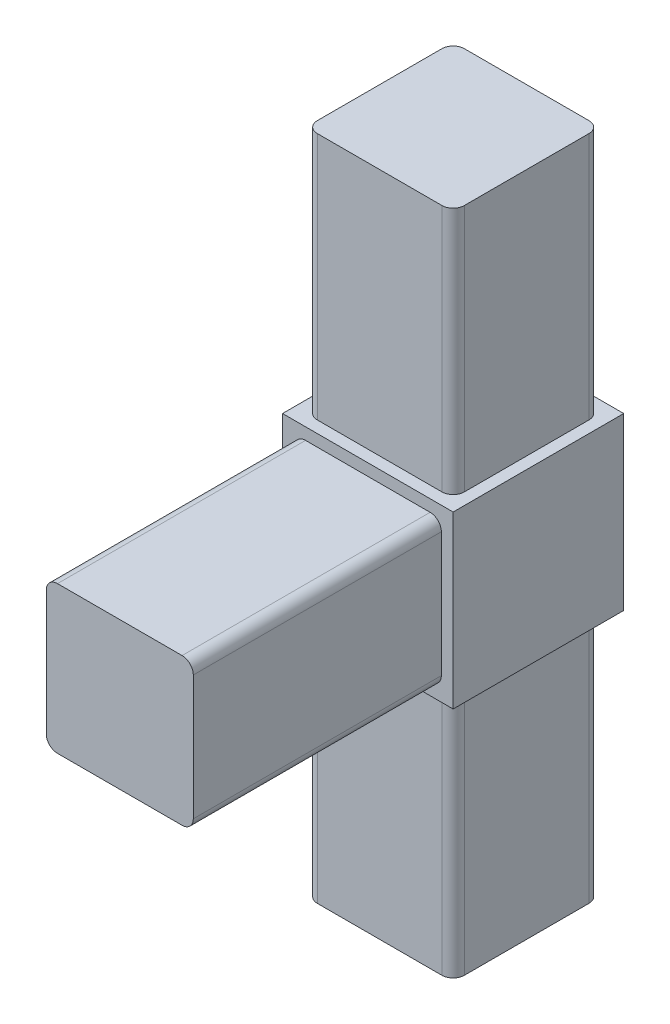
ISO-10303-21;
HEADER;
FILE_DESCRIPTION(('STEP AP214'),'2;1');
FILE_NAME('part.step','',(''),(''),'','','');
FILE_SCHEMA(('AUTOMOTIVE_DESIGN { 1 0 10303 214 1 1 1 1 }'));
ENDSEC;
DATA;
#1=APPLICATION_CONTEXT('core data for automotive mechanical design processes');
#2=APPLICATION_PROTOCOL_DEFINITION('international standard','automotive_design',2000,#1);
#3=PRODUCT_CONTEXT('',#1,'mechanical');
#4=PRODUCT('Part','Part','',(#3));
#5=PRODUCT_RELATED_PRODUCT_CATEGORY('part','',(#4));
#6=PRODUCT_DEFINITION_FORMATION('','',#4);
#7=PRODUCT_DEFINITION_CONTEXT('part definition',#1,'design');
#8=PRODUCT_DEFINITION('design','',#6,#7);
#9=PRODUCT_DEFINITION_SHAPE('','',#8);
#10=(LENGTH_UNIT() NAMED_UNIT(*) SI_UNIT(.MILLI.,.METRE.));
#11=(NAMED_UNIT(*) PLANE_ANGLE_UNIT() SI_UNIT($,.RADIAN.));
#12=(NAMED_UNIT(*) SI_UNIT($,.STERADIAN.) SOLID_ANGLE_UNIT());
#13=UNCERTAINTY_MEASURE_WITH_UNIT(LENGTH_MEASURE(1.E-05),#10,'distance_accuracy_value','');
#14=(GEOMETRIC_REPRESENTATION_CONTEXT(3) GLOBAL_UNCERTAINTY_ASSIGNED_CONTEXT((#13)) GLOBAL_UNIT_ASSIGNED_CONTEXT((#10,
#11,#12)) REPRESENTATION_CONTEXT('',''));
#15=CARTESIAN_POINT('',(0.,0.,0.));
#16=DIRECTION('',(0.,0.,1.));
#17=DIRECTION('',(1.,0.,0.));
#18=AXIS2_PLACEMENT_3D('',#15,#16,#17);
#19=CARTESIAN_POINT('',(0.,47.371,0.));
#20=DIRECTION('',(0.,-1.,0.));
#21=DIRECTION('',(0.,0.,-1.));
#22=AXIS2_PLACEMENT_3D('',#19,#20,#21);
#23=PLANE('',#22);
#24=DIRECTION('',(0.,0.,-1.));
#25=VECTOR('',#24,1.);
#26=CARTESIAN_POINT('',(9.652,47.371,9.652));
#27=LINE('',#26,#25);
#28=CARTESIAN_POINT('',(9.652,47.371,9.652));
#29=VERTEX_POINT('',#28);
#30=CARTESIAN_POINT('',(9.652,47.371,-9.652));
#31=VERTEX_POINT('',#30);
#32=EDGE_CURVE('E229',#29,#31,#27,.T.);
#33=ORIENTED_EDGE('',*,*,#32,.T.);
#34=DIRECTION('',(-1.,0.,0.));
#35=VECTOR('',#34,1.);
#36=CARTESIAN_POINT('',(-9.652,47.371,-9.652));
#37=LINE('',#36,#35);
#38=CARTESIAN_POINT('',(-9.652,47.371,-9.652));
#39=VERTEX_POINT('',#38);
#40=EDGE_CURVE('E218',#31,#39,#37,.T.);
#41=ORIENTED_EDGE('',*,*,#40,.T.);
#42=DIRECTION('',(0.,0.,1.));
#43=VECTOR('',#42,1.);
#44=CARTESIAN_POINT('',(-9.652,47.371,9.652));
#45=LINE('',#44,#43);
#46=CARTESIAN_POINT('',(-9.652,47.371,9.652));
#47=VERTEX_POINT('',#46);
#48=EDGE_CURVE('E228',#39,#47,#45,.T.);
#49=ORIENTED_EDGE('',*,*,#48,.T.);
#50=DIRECTION('',(1.,0.,0.));
#51=VECTOR('',#50,1.);
#52=CARTESIAN_POINT('',(-9.652,47.371,9.652));
#53=LINE('',#52,#51);
#54=EDGE_CURVE('E234',#47,#29,#53,.T.);
#55=ORIENTED_EDGE('',*,*,#54,.T.);
#56=EDGE_LOOP('',(#33,#41,#49,#55));
#57=FACE_BOUND('',#56,.T.);
#58=DIRECTION('',(0.,0.,-1.));
#59=VECTOR('',#58,1.);
#60=CARTESIAN_POINT('',(8.3185,47.371,8.3185));
#61=LINE('',#60,#59);
#62=CARTESIAN_POINT('',(8.3185,47.371,7.0485));
#63=VERTEX_POINT('',#62);
#64=CARTESIAN_POINT('',(8.3185,47.371,-7.0485));
#65=VERTEX_POINT('',#64);
#66=EDGE_CURVE('E596',#63,#65,#61,.T.);
#67=ORIENTED_EDGE('',*,*,#66,.F.);
#68=CARTESIAN_POINT('',(7.0485,47.371,7.0485));
#69=DIRECTION('',(0.,-1.,0.));
#70=DIRECTION('',(0.,0.,-1.));
#71=AXIS2_PLACEMENT_3D('',#68,#69,#70);
#72=CIRCLE('',#71,1.27);
#73=CARTESIAN_POINT('',(7.0485,47.371,8.3185));
#74=VERTEX_POINT('',#73);
#75=EDGE_CURVE('E357',#63,#74,#72,.T.);
#76=ORIENTED_EDGE('',*,*,#75,.T.);
#77=DIRECTION('',(1.,0.,0.));
#78=VECTOR('',#77,1.);
#79=CARTESIAN_POINT('',(-8.3185,47.371,8.3185));
#80=LINE('',#79,#78);
#81=CARTESIAN_POINT('',(-7.0485,47.371,8.3185));
#82=VERTEX_POINT('',#81);
#83=EDGE_CURVE('E405',#82,#74,#80,.T.);
#84=ORIENTED_EDGE('',*,*,#83,.F.);
#85=CARTESIAN_POINT('',(-7.0485,47.371,7.0485));
#86=DIRECTION('',(0.,-1.,0.));
#87=DIRECTION('',(0.,0.,-1.));
#88=AXIS2_PLACEMENT_3D('',#85,#86,#87);
#89=CIRCLE('',#88,1.27);
#90=CARTESIAN_POINT('',(-8.3185,47.371,7.0485));
#91=VERTEX_POINT('',#90);
#92=EDGE_CURVE('E355',#82,#91,#89,.T.);
#93=ORIENTED_EDGE('',*,*,#92,.T.);
#94=DIRECTION('',(0.,0.,1.));
#95=VECTOR('',#94,1.);
#96=CARTESIAN_POINT('',(-8.3185,47.371,8.3185));
#97=LINE('',#96,#95);
#98=CARTESIAN_POINT('',(-8.3185,47.371,-7.0485));
#99=VERTEX_POINT('',#98);
#100=EDGE_CURVE('E591',#99,#91,#97,.T.);
#101=ORIENTED_EDGE('',*,*,#100,.F.);
#102=CARTESIAN_POINT('',(-7.0485,47.371,-7.0485));
#103=DIRECTION('',(0.,-1.,0.));
#104=DIRECTION('',(0.,0.,-1.));
#105=AXIS2_PLACEMENT_3D('',#102,#103,#104);
#106=CIRCLE('',#105,1.27);
#107=CARTESIAN_POINT('',(-7.0485,47.371,-8.3185));
#108=VERTEX_POINT('',#107);
#109=EDGE_CURVE('E359',#99,#108,#106,.T.);
#110=ORIENTED_EDGE('',*,*,#109,.T.);
#111=DIRECTION('',(-1.,0.,0.));
#112=VECTOR('',#111,1.);
#113=CARTESIAN_POINT('',(-8.3185,47.371,-8.3185));
#114=LINE('',#113,#112);
#115=CARTESIAN_POINT('',(7.0485,47.371,-8.3185));
#116=VERTEX_POINT('',#115);
#117=EDGE_CURVE('E594',#116,#108,#114,.T.);
#118=ORIENTED_EDGE('',*,*,#117,.F.);
#119=CARTESIAN_POINT('',(7.0485,47.371,-7.0485));
#120=DIRECTION('',(0.,-1.,0.));
#121=DIRECTION('',(0.,0.,-1.));
#122=AXIS2_PLACEMENT_3D('',#119,#120,#121);
#123=CIRCLE('',#122,1.27);
#124=EDGE_CURVE('E361',#116,#65,#123,.T.);
#125=ORIENTED_EDGE('',*,*,#124,.T.);
#126=EDGE_LOOP('',(#67,#76,#84,#93,#101,#110,#118,#125));
#127=FACE_BOUND('',#126,.T.);
#128=ADVANCED_FACE('F34',(#57,#127),#23,.F.);
#129=CARTESIAN_POINT('',(-9.652,47.371,9.652));
#130=DIRECTION('',(0.,0.,-1.));
#131=DIRECTION('',(-1.,0.,0.));
#132=AXIS2_PLACEMENT_3D('',#129,#130,#131);
#133=PLANE('',#132);
#134=DIRECTION('',(1.,0.,0.));
#135=VECTOR('',#134,1.);
#136=CARTESIAN_POINT('',(-9.652,28.067,9.652));
#137=LINE('',#136,#135);
#138=CARTESIAN_POINT('',(-9.652,28.067,9.652));
#139=VERTEX_POINT('',#138);
#140=CARTESIAN_POINT('',(9.652,28.067,9.652));
#141=VERTEX_POINT('',#140);
#142=EDGE_CURVE('E238',#139,#141,#137,.T.);
#143=ORIENTED_EDGE('',*,*,#142,.T.);
#144=DIRECTION('',(0.,-1.,0.));
#145=VECTOR('',#144,1.);
#146=CARTESIAN_POINT('',(9.652,47.371,9.652));
#147=LINE('',#146,#145);
#148=EDGE_CURVE('E419',#29,#141,#147,.T.);
#149=ORIENTED_EDGE('',*,*,#148,.F.);
#150=ORIENTED_EDGE('',*,*,#54,.F.);
#151=DIRECTION('',(0.,-1.,0.));
#152=VECTOR('',#151,1.);
#153=CARTESIAN_POINT('',(-9.652,47.371,9.652));
#154=LINE('',#153,#152);
#155=EDGE_CURVE('E248',#47,#139,#154,.T.);
#156=ORIENTED_EDGE('',*,*,#155,.T.);
#157=EDGE_LOOP('',(#143,#149,#150,#156));
#158=FACE_BOUND('',#157,.T.);
#159=DIRECTION('',(0.,1.,0.));
#160=VECTOR('',#159,1.);
#161=CARTESIAN_POINT('',(8.3185,29.4005,9.652));
#162=LINE('',#161,#160);
#163=CARTESIAN_POINT('',(8.3185,30.6705,9.652));
#164=VERTEX_POINT('',#163);
#165=CARTESIAN_POINT('',(8.3185,44.7675,9.652));
#166=VERTEX_POINT('',#165);
#167=EDGE_CURVE('E378',#164,#166,#162,.T.);
#168=ORIENTED_EDGE('',*,*,#167,.F.);
#169=CARTESIAN_POINT('',(7.0485,30.6705,9.652));
#170=DIRECTION('',(0.,0.,-1.));
#171=DIRECTION('',(-1.,0.,0.));
#172=AXIS2_PLACEMENT_3D('',#169,#170,#171);
#173=CIRCLE('',#172,1.27);
#174=CARTESIAN_POINT('',(7.0485,29.4005,9.652));
#175=VERTEX_POINT('',#174);
#176=EDGE_CURVE('E42',#164,#175,#173,.T.);
#177=ORIENTED_EDGE('',*,*,#176,.T.);
#178=DIRECTION('',(1.,0.,0.));
#179=VECTOR('',#178,1.);
#180=CARTESIAN_POINT('',(-8.3185,29.4005,9.652));
#181=LINE('',#180,#179);
#182=CARTESIAN_POINT('',(-7.0485,29.4005,9.652));
#183=VERTEX_POINT('',#182);
#184=EDGE_CURVE('E377',#183,#175,#181,.T.);
#185=ORIENTED_EDGE('',*,*,#184,.F.);
#186=CARTESIAN_POINT('',(-7.0485,30.6705,9.652));
#187=DIRECTION('',(0.,0.,-1.));
#188=DIRECTION('',(-1.,0.,0.));
#189=AXIS2_PLACEMENT_3D('',#186,#187,#188);
#190=CIRCLE('',#189,1.27);
#191=CARTESIAN_POINT('',(-8.3185,30.6705,9.652));
#192=VERTEX_POINT('',#191);
#193=EDGE_CURVE('E371',#183,#192,#190,.T.);
#194=ORIENTED_EDGE('',*,*,#193,.T.);
#195=DIRECTION('',(0.,-1.,0.));
#196=VECTOR('',#195,1.);
#197=CARTESIAN_POINT('',(-8.3185,29.4005,9.652));
#198=LINE('',#197,#196);
#199=CARTESIAN_POINT('',(-8.3185,44.7675,9.652));
#200=VERTEX_POINT('',#199);
#201=EDGE_CURVE('E385',#200,#192,#198,.T.);
#202=ORIENTED_EDGE('',*,*,#201,.F.);
#203=CARTESIAN_POINT('',(-7.0485,44.7675,9.652));
#204=DIRECTION('',(0.,0.,-1.));
#205=DIRECTION('',(-1.,0.,0.));
#206=AXIS2_PLACEMENT_3D('',#203,#204,#205);
#207=CIRCLE('',#206,1.27);
#208=CARTESIAN_POINT('',(-7.0485,46.0375,9.652));
#209=VERTEX_POINT('',#208);
#210=EDGE_CURVE('E373',#200,#209,#207,.T.);
#211=ORIENTED_EDGE('',*,*,#210,.T.);
#212=DIRECTION('',(-1.,0.,0.));
#213=VECTOR('',#212,1.);
#214=CARTESIAN_POINT('',(-8.3185,46.0375,9.652));
#215=LINE('',#214,#213);
#216=CARTESIAN_POINT('',(7.0485,46.0375,9.652));
#217=VERTEX_POINT('',#216);
#218=EDGE_CURVE('E411',#217,#209,#215,.T.);
#219=ORIENTED_EDGE('',*,*,#218,.F.);
#220=CARTESIAN_POINT('',(7.0485,44.7675,9.652));
#221=DIRECTION('',(0.,0.,-1.));
#222=DIRECTION('',(-1.,0.,0.));
#223=AXIS2_PLACEMENT_3D('',#220,#221,#222);
#224=CIRCLE('',#223,1.27);
#225=EDGE_CURVE('E11',#217,#166,#224,.T.);
#226=ORIENTED_EDGE('',*,*,#225,.T.);
#227=EDGE_LOOP('',(#168,#177,#185,#194,#202,#211,#219,#226));
#228=FACE_BOUND('',#227,.T.);
#229=ADVANCED_FACE('F376',(#158,#228),#133,.F.);
#230=CARTESIAN_POINT('',(8.3185,28.067,-8.3185));
#231=DIRECTION('',(-1.,0.,0.));
#232=DIRECTION('',(0.,0.,1.));
#233=AXIS2_PLACEMENT_3D('',#230,#231,#232);
#234=PLANE('',#233);
#235=DIRECTION('',(0.,0.,-1.));
#236=VECTOR('',#235,1.);
#237=CARTESIAN_POINT('',(8.3185,28.067,-8.3185));
#238=LINE('',#237,#236);
#239=CARTESIAN_POINT('',(8.3185,28.067,7.0485));
#240=VERTEX_POINT('',#239);
#241=CARTESIAN_POINT('',(8.3185,28.067,-7.0485));
#242=VERTEX_POINT('',#241);
#243=EDGE_CURVE('E252',#240,#242,#238,.T.);
#244=ORIENTED_EDGE('',*,*,#243,.F.);
#245=DIRECTION('',(0.,-1.,0.));
#246=VECTOR('',#245,1.);
#247=CARTESIAN_POINT('',(8.3185,28.067,7.0485));
#248=LINE('',#247,#246);
#249=CARTESIAN_POINT('',(8.3185,0.,7.0485));
#250=VERTEX_POINT('',#249);
#251=EDGE_CURVE('E320',#240,#250,#248,.T.);
#252=ORIENTED_EDGE('',*,*,#251,.T.);
#253=DIRECTION('',(0.,0.,-1.));
#254=VECTOR('',#253,1.);
#255=CARTESIAN_POINT('',(8.3185,0.,-8.3185));
#256=LINE('',#255,#254);
#257=CARTESIAN_POINT('',(8.3185,0.,-7.0485));
#258=VERTEX_POINT('',#257);
#259=EDGE_CURVE('E243',#250,#258,#256,.T.);
#260=ORIENTED_EDGE('',*,*,#259,.T.);
#261=DIRECTION('',(0.,-1.,0.));
#262=VECTOR('',#261,1.);
#263=CARTESIAN_POINT('',(8.3185,28.067,-7.0485));
#264=LINE('',#263,#262);
#265=EDGE_CURVE('E318',#258,#242,#264,.F.);
#266=ORIENTED_EDGE('',*,*,#265,.T.);
#267=EDGE_LOOP('',(#244,#252,#260,#266));
#268=FACE_BOUND('',#267,.T.);
#269=ADVANCED_FACE('F451',(#268),#234,.F.);
#270=CARTESIAN_POINT('',(-8.3185,28.067,-8.3185));
#271=DIRECTION('',(0.,0.,1.));
#272=DIRECTION('',(1.,0.,0.));
#273=AXIS2_PLACEMENT_3D('',#270,#271,#272);
#274=PLANE('',#273);
#275=DIRECTION('',(-1.,0.,0.));
#276=VECTOR('',#275,1.);
#277=CARTESIAN_POINT('',(-8.3185,0.,-8.3185));
#278=LINE('',#277,#276);
#279=CARTESIAN_POINT('',(7.0485,0.,-8.3185));
#280=VERTEX_POINT('',#279);
#281=CARTESIAN_POINT('',(-7.0485,0.,-8.3185));
#282=VERTEX_POINT('',#281);
#283=EDGE_CURVE('E246',#280,#282,#278,.T.);
#284=ORIENTED_EDGE('',*,*,#283,.T.);
#285=DIRECTION('',(0.,-1.,0.));
#286=VECTOR('',#285,1.);
#287=CARTESIAN_POINT('',(-7.0485,28.067,-8.3185));
#288=LINE('',#287,#286);
#289=CARTESIAN_POINT('',(-7.0485,28.067,-8.3185));
#290=VERTEX_POINT('',#289);
#291=EDGE_CURVE('E326',#282,#290,#288,.F.);
#292=ORIENTED_EDGE('',*,*,#291,.T.);
#293=DIRECTION('',(-1.,0.,0.));
#294=VECTOR('',#293,1.);
#295=CARTESIAN_POINT('',(-8.3185,28.067,-8.3185));
#296=LINE('',#295,#294);
#297=CARTESIAN_POINT('',(7.0485,28.067,-8.3185));
#298=VERTEX_POINT('',#297);
#299=EDGE_CURVE('E255',#298,#290,#296,.T.);
#300=ORIENTED_EDGE('',*,*,#299,.F.);
#301=DIRECTION('',(0.,-1.,0.));
#302=VECTOR('',#301,1.);
#303=CARTESIAN_POINT('',(7.0485,28.067,-8.3185));
#304=LINE('',#303,#302);
#305=EDGE_CURVE('E323',#298,#280,#304,.T.);
#306=ORIENTED_EDGE('',*,*,#305,.T.);
#307=EDGE_LOOP('',(#284,#292,#300,#306));
#308=FACE_BOUND('',#307,.T.);
#309=ADVANCED_FACE('F474',(#308),#274,.F.);
#310=CARTESIAN_POINT('',(-8.3185,28.067,-8.3185));
#311=DIRECTION('',(1.,0.,0.));
#312=DIRECTION('',(0.,0.,-1.));
#313=AXIS2_PLACEMENT_3D('',#310,#311,#312);
#314=PLANE('',#313);
#315=DIRECTION('',(0.,0.,1.));
#316=VECTOR('',#315,1.);
#317=CARTESIAN_POINT('',(-8.3185,0.,-8.3185));
#318=LINE('',#317,#316);
#319=CARTESIAN_POINT('',(-8.3185,0.,-7.0485));
#320=VERTEX_POINT('',#319);
#321=CARTESIAN_POINT('',(-8.3185,0.,7.0485));
#322=VERTEX_POINT('',#321);
#323=EDGE_CURVE('E268',#320,#322,#318,.T.);
#324=ORIENTED_EDGE('',*,*,#323,.T.);
#325=DIRECTION('',(0.,-1.,0.));
#326=VECTOR('',#325,1.);
#327=CARTESIAN_POINT('',(-8.3185,28.067,7.0485));
#328=LINE('',#327,#326);
#329=CARTESIAN_POINT('',(-8.3185,28.067,7.0485));
#330=VERTEX_POINT('',#329);
#331=EDGE_CURVE('E316',#322,#330,#328,.F.);
#332=ORIENTED_EDGE('',*,*,#331,.T.);
#333=DIRECTION('',(0.,0.,1.));
#334=VECTOR('',#333,1.);
#335=CARTESIAN_POINT('',(-8.3185,28.067,-8.3185));
#336=LINE('',#335,#334);
#337=CARTESIAN_POINT('',(-8.3185,28.067,-7.0485));
#338=VERTEX_POINT('',#337);
#339=EDGE_CURVE('E259',#338,#330,#336,.T.);
#340=ORIENTED_EDGE('',*,*,#339,.F.);
#341=DIRECTION('',(0.,-1.,0.));
#342=VECTOR('',#341,1.);
#343=CARTESIAN_POINT('',(-8.3185,28.067,-7.0485));
#344=LINE('',#343,#342);
#345=EDGE_CURVE('E313',#338,#320,#344,.T.);
#346=ORIENTED_EDGE('',*,*,#345,.T.);
#347=EDGE_LOOP('',(#324,#332,#340,#346));
#348=FACE_BOUND('',#347,.T.);
#349=ADVANCED_FACE('F467',(#348),#314,.F.);
#350=CARTESIAN_POINT('',(-8.3185,28.067,8.3185));
#351=DIRECTION('',(0.,0.,-1.));
#352=DIRECTION('',(-1.,0.,0.));
#353=AXIS2_PLACEMENT_3D('',#350,#351,#352);
#354=PLANE('',#353);
#355=DIRECTION('',(1.,0.,0.));
#356=VECTOR('',#355,1.);
#357=CARTESIAN_POINT('',(-8.3185,28.067,8.3185));
#358=LINE('',#357,#356);
#359=CARTESIAN_POINT('',(-7.0485,28.067,8.3185));
#360=VERTEX_POINT('',#359);
#361=CARTESIAN_POINT('',(7.0485,28.067,8.3185));
#362=VERTEX_POINT('',#361);
#363=EDGE_CURVE('E262',#360,#362,#358,.T.);
#364=ORIENTED_EDGE('',*,*,#363,.F.);
#365=DIRECTION('',(0.,-1.,0.));
#366=VECTOR('',#365,1.);
#367=CARTESIAN_POINT('',(-7.0485,28.067,8.3185));
#368=LINE('',#367,#366);
#369=CARTESIAN_POINT('',(-7.0485,0.,8.3185));
#370=VERTEX_POINT('',#369);
#371=EDGE_CURVE('E302',#360,#370,#368,.T.);
#372=ORIENTED_EDGE('',*,*,#371,.T.);
#373=DIRECTION('',(1.,0.,0.));
#374=VECTOR('',#373,1.);
#375=CARTESIAN_POINT('',(-8.3185,0.,8.3185));
#376=LINE('',#375,#374);
#377=CARTESIAN_POINT('',(7.0485,0.,8.3185));
#378=VERTEX_POINT('',#377);
#379=EDGE_CURVE('E256',#370,#378,#376,.T.);
#380=ORIENTED_EDGE('',*,*,#379,.T.);
#381=DIRECTION('',(0.,-1.,0.));
#382=VECTOR('',#381,1.);
#383=CARTESIAN_POINT('',(7.0485,28.067,8.3185));
#384=LINE('',#383,#382);
#385=EDGE_CURVE('E300',#378,#362,#384,.F.);
#386=ORIENTED_EDGE('',*,*,#385,.T.);
#387=EDGE_LOOP('',(#364,#372,#380,#386));
#388=FACE_BOUND('',#387,.T.);
#389=ADVANCED_FACE('F461',(#388),#354,.F.);
#390=CARTESIAN_POINT('',(0.,0.,0.));
#391=DIRECTION('',(0.,1.,0.));
#392=DIRECTION('',(0.,0.,1.));
#393=AXIS2_PLACEMENT_3D('',#390,#391,#392);
#394=PLANE('',#393);
#395=ORIENTED_EDGE('',*,*,#379,.F.);
#396=CARTESIAN_POINT('',(-7.0485,0.,7.0485));
#397=DIRECTION('',(0.,1.,0.));
#398=DIRECTION('',(0.,0.,1.));
#399=AXIS2_PLACEMENT_3D('',#396,#397,#398);
#400=CIRCLE('',#399,1.27);
#401=EDGE_CURVE('E311',#370,#322,#400,.F.);
#402=ORIENTED_EDGE('',*,*,#401,.T.);
#403=ORIENTED_EDGE('',*,*,#323,.F.);
#404=CARTESIAN_POINT('',(-7.0485,0.,-7.0485));
#405=DIRECTION('',(0.,1.,0.));
#406=DIRECTION('',(0.,0.,1.));
#407=AXIS2_PLACEMENT_3D('',#404,#405,#406);
#408=CIRCLE('',#407,1.27);
#409=EDGE_CURVE('E307',#320,#282,#408,.F.);
#410=ORIENTED_EDGE('',*,*,#409,.T.);
#411=ORIENTED_EDGE('',*,*,#283,.F.);
#412=CARTESIAN_POINT('',(7.0485,0.,-7.0485));
#413=DIRECTION('',(0.,1.,0.));
#414=DIRECTION('',(0.,0.,1.));
#415=AXIS2_PLACEMENT_3D('',#412,#413,#414);
#416=CIRCLE('',#415,1.27);
#417=EDGE_CURVE('E305',#280,#258,#416,.F.);
#418=ORIENTED_EDGE('',*,*,#417,.T.);
#419=ORIENTED_EDGE('',*,*,#259,.F.);
#420=CARTESIAN_POINT('',(7.0485,0.,7.0485));
#421=DIRECTION('',(0.,1.,0.));
#422=DIRECTION('',(0.,0.,1.));
#423=AXIS2_PLACEMENT_3D('',#420,#421,#422);
#424=CIRCLE('',#423,1.27);
#425=EDGE_CURVE('E309',#250,#378,#424,.F.);
#426=ORIENTED_EDGE('',*,*,#425,.T.);
#427=EDGE_LOOP('',(#395,#402,#403,#410,#411,#418,#419,#426));
#428=FACE_BOUND('',#427,.T.);
#429=ADVANCED_FACE('F455',(#428),#394,.F.);
#430=CARTESIAN_POINT('',(0.,28.067,0.));
#431=DIRECTION('',(0.,-1.,0.));
#432=DIRECTION('',(0.,0.,-1.));
#433=AXIS2_PLACEMENT_3D('',#430,#431,#432);
#434=PLANE('',#433);
#435=DIRECTION('',(0.,0.,-1.));
#436=VECTOR('',#435,1.);
#437=CARTESIAN_POINT('',(9.652,28.067,9.652));
#438=LINE('',#437,#436);
#439=CARTESIAN_POINT('',(9.652,28.067,-9.652));
#440=VERTEX_POINT('',#439);
#441=EDGE_CURVE('E242',#141,#440,#438,.T.);
#442=ORIENTED_EDGE('',*,*,#441,.F.);
#443=ORIENTED_EDGE('',*,*,#142,.F.);
#444=DIRECTION('',(0.,0.,1.));
#445=VECTOR('',#444,1.);
#446=CARTESIAN_POINT('',(-9.652,28.067,9.652));
#447=LINE('',#446,#445);
#448=CARTESIAN_POINT('',(-9.652,28.067,-9.652));
#449=VERTEX_POINT('',#448);
#450=EDGE_CURVE('E423',#449,#139,#447,.T.);
#451=ORIENTED_EDGE('',*,*,#450,.F.);
#452=DIRECTION('',(-1.,0.,0.));
#453=VECTOR('',#452,1.);
#454=CARTESIAN_POINT('',(-9.652,28.067,-9.652));
#455=LINE('',#454,#453);
#456=EDGE_CURVE('E421',#440,#449,#455,.T.);
#457=ORIENTED_EDGE('',*,*,#456,.F.);
#458=EDGE_LOOP('',(#442,#443,#451,#457));
#459=FACE_BOUND('',#458,.T.);
#460=ORIENTED_EDGE('',*,*,#363,.T.);
#461=CARTESIAN_POINT('',(7.0485,28.067,7.0485));
#462=DIRECTION('',(0.,-1.,0.));
#463=DIRECTION('',(0.,0.,-1.));
#464=AXIS2_PLACEMENT_3D('',#461,#462,#463);
#465=CIRCLE('',#464,1.27);
#466=EDGE_CURVE('E365',#362,#240,#465,.F.);
#467=ORIENTED_EDGE('',*,*,#466,.T.);
#468=ORIENTED_EDGE('',*,*,#243,.T.);
#469=CARTESIAN_POINT('',(7.0485,28.067,-7.0485));
#470=DIRECTION('',(0.,-1.,0.));
#471=DIRECTION('',(0.,0.,-1.));
#472=AXIS2_PLACEMENT_3D('',#469,#470,#471);
#473=CIRCLE('',#472,1.27);
#474=EDGE_CURVE('E369',#242,#298,#473,.F.);
#475=ORIENTED_EDGE('',*,*,#474,.T.);
#476=ORIENTED_EDGE('',*,*,#299,.T.);
#477=CARTESIAN_POINT('',(-7.0485,28.067,-7.0485));
#478=DIRECTION('',(0.,-1.,0.));
#479=DIRECTION('',(0.,0.,-1.));
#480=AXIS2_PLACEMENT_3D('',#477,#478,#479);
#481=CIRCLE('',#480,1.27);
#482=EDGE_CURVE('E367',#290,#338,#481,.F.);
#483=ORIENTED_EDGE('',*,*,#482,.T.);
#484=ORIENTED_EDGE('',*,*,#339,.T.);
#485=CARTESIAN_POINT('',(-7.0485,28.067,7.0485));
#486=DIRECTION('',(0.,-1.,0.));
#487=DIRECTION('',(0.,0.,-1.));
#488=AXIS2_PLACEMENT_3D('',#485,#486,#487);
#489=CIRCLE('',#488,1.27);
#490=EDGE_CURVE('E363',#330,#360,#489,.F.);
#491=ORIENTED_EDGE('',*,*,#490,.T.);
#492=EDGE_LOOP('',(#460,#467,#468,#475,#476,#483,#484,#491));
#493=FACE_BOUND('',#492,.T.);
#494=ADVANCED_FACE('F433',(#459,#493),#434,.T.);
#495=CARTESIAN_POINT('',(9.652,47.371,9.652));
#496=DIRECTION('',(-1.,0.,0.));
#497=DIRECTION('',(0.,0.,1.));
#498=AXIS2_PLACEMENT_3D('',#495,#496,#497);
#499=PLANE('',#498);
#500=ORIENTED_EDGE('',*,*,#441,.T.);
#501=DIRECTION('',(0.,-1.,0.));
#502=VECTOR('',#501,1.);
#503=CARTESIAN_POINT('',(9.652,47.371,-9.652));
#504=LINE('',#503,#502);
#505=EDGE_CURVE('E222',#31,#440,#504,.T.);
#506=ORIENTED_EDGE('',*,*,#505,.F.);
#507=ORIENTED_EDGE('',*,*,#32,.F.);
#508=ORIENTED_EDGE('',*,*,#148,.T.);
#509=EDGE_LOOP('',(#500,#506,#507,#508));
#510=FACE_BOUND('',#509,.T.);
#511=ADVANCED_FACE('F240',(#510),#499,.F.);
#512=CARTESIAN_POINT('',(-9.652,47.371,-9.652));
#513=DIRECTION('',(0.,0.,1.));
#514=DIRECTION('',(1.,0.,0.));
#515=AXIS2_PLACEMENT_3D('',#512,#513,#514);
#516=PLANE('',#515);
#517=ORIENTED_EDGE('',*,*,#456,.T.);
#518=DIRECTION('',(0.,-1.,0.));
#519=VECTOR('',#518,1.);
#520=CARTESIAN_POINT('',(-9.652,47.371,-9.652));
#521=LINE('',#520,#519);
#522=EDGE_CURVE('E225',#39,#449,#521,.T.);
#523=ORIENTED_EDGE('',*,*,#522,.F.);
#524=ORIENTED_EDGE('',*,*,#40,.F.);
#525=ORIENTED_EDGE('',*,*,#505,.T.);
#526=EDGE_LOOP('',(#517,#523,#524,#525));
#527=FACE_BOUND('',#526,.T.);
#528=ADVANCED_FACE('F220',(#527),#516,.F.);
#529=CARTESIAN_POINT('',(-9.652,47.371,9.652));
#530=DIRECTION('',(1.,0.,0.));
#531=DIRECTION('',(0.,0.,-1.));
#532=AXIS2_PLACEMENT_3D('',#529,#530,#531);
#533=PLANE('',#532);
#534=ORIENTED_EDGE('',*,*,#450,.T.);
#535=ORIENTED_EDGE('',*,*,#155,.F.);
#536=ORIENTED_EDGE('',*,*,#48,.F.);
#537=ORIENTED_EDGE('',*,*,#522,.T.);
#538=EDGE_LOOP('',(#534,#535,#536,#537));
#539=FACE_BOUND('',#538,.T.);
#540=ADVANCED_FACE('F435',(#539),#533,.F.);
#541=CARTESIAN_POINT('',(8.3185,29.4005,37.719));
#542=DIRECTION('',(-1.,0.,0.));
#543=DIRECTION('',(0.,0.,1.));
#544=AXIS2_PLACEMENT_3D('',#541,#542,#543);
#545=PLANE('',#544);
#546=DIRECTION('',(0.,1.,0.));
#547=VECTOR('',#546,1.);
#548=CARTESIAN_POINT('',(8.3185,29.4005,37.719));
#549=LINE('',#548,#547);
#550=CARTESIAN_POINT('',(8.3185,30.6705,37.719));
#551=VERTEX_POINT('',#550);
#552=CARTESIAN_POINT('',(8.3185,44.7675,37.719));
#553=VERTEX_POINT('',#552);
#554=EDGE_CURVE('E384',#551,#553,#549,.T.);
#555=ORIENTED_EDGE('',*,*,#554,.F.);
#556=DIRECTION('',(0.,0.,-1.));
#557=VECTOR('',#556,1.);
#558=CARTESIAN_POINT('',(8.3185,30.6705,37.719));
#559=LINE('',#558,#557);
#560=EDGE_CURVE('E353',#551,#164,#559,.T.);
#561=ORIENTED_EDGE('',*,*,#560,.T.);
#562=ORIENTED_EDGE('',*,*,#167,.T.);
#563=DIRECTION('',(0.,0.,-1.));
#564=VECTOR('',#563,1.);
#565=CARTESIAN_POINT('',(8.3185,44.7675,37.719));
#566=LINE('',#565,#564);
#567=EDGE_CURVE('E351',#166,#553,#566,.F.);
#568=ORIENTED_EDGE('',*,*,#567,.T.);
#569=EDGE_LOOP('',(#555,#561,#562,#568));
#570=FACE_BOUND('',#569,.T.);
#571=ADVANCED_FACE('F397',(#570),#545,.F.);
#572=CARTESIAN_POINT('',(-8.3185,46.0375,37.719));
#573=DIRECTION('',(0.,-1.,0.));
#574=DIRECTION('',(0.,0.,-1.));
#575=AXIS2_PLACEMENT_3D('',#572,#573,#574);
#576=PLANE('',#575);
#577=ORIENTED_EDGE('',*,*,#218,.T.);
#578=DIRECTION('',(0.,0.,-1.));
#579=VECTOR('',#578,1.);
#580=CARTESIAN_POINT('',(-7.0485,46.0375,37.719));
#581=LINE('',#580,#579);
#582=CARTESIAN_POINT('',(-7.0485,46.0375,37.719));
#583=VERTEX_POINT('',#582);
#584=EDGE_CURVE('E349',#209,#583,#581,.F.);
#585=ORIENTED_EDGE('',*,*,#584,.T.);
#586=DIRECTION('',(-1.,0.,0.));
#587=VECTOR('',#586,1.);
#588=CARTESIAN_POINT('',(-8.3185,46.0375,37.719));
#589=LINE('',#588,#587);
#590=CARTESIAN_POINT('',(7.0485,46.0375,37.719));
#591=VERTEX_POINT('',#590);
#592=EDGE_CURVE('E399',#591,#583,#589,.T.);
#593=ORIENTED_EDGE('',*,*,#592,.F.);
#594=DIRECTION('',(0.,0.,-1.));
#595=VECTOR('',#594,1.);
#596=CARTESIAN_POINT('',(7.0485,46.0375,37.719));
#597=LINE('',#596,#595);
#598=EDGE_CURVE('E346',#591,#217,#597,.T.);
#599=ORIENTED_EDGE('',*,*,#598,.T.);
#600=EDGE_LOOP('',(#577,#585,#593,#599));
#601=FACE_BOUND('',#600,.T.);
#602=ADVANCED_FACE('F442',(#601),#576,.F.);
#603=CARTESIAN_POINT('',(-8.3185,29.4005,37.719));
#604=DIRECTION('',(1.,0.,0.));
#605=DIRECTION('',(0.,0.,-1.));
#606=AXIS2_PLACEMENT_3D('',#603,#604,#605);
#607=PLANE('',#606);
#608=ORIENTED_EDGE('',*,*,#201,.T.);
#609=DIRECTION('',(0.,0.,-1.));
#610=VECTOR('',#609,1.);
#611=CARTESIAN_POINT('',(-8.3185,30.6705,37.719));
#612=LINE('',#611,#610);
#613=CARTESIAN_POINT('',(-8.3185,30.6705,37.719));
#614=VERTEX_POINT('',#613);
#615=EDGE_CURVE('E336',#192,#614,#612,.F.);
#616=ORIENTED_EDGE('',*,*,#615,.T.);
#617=DIRECTION('',(0.,-1.,0.));
#618=VECTOR('',#617,1.);
#619=CARTESIAN_POINT('',(-8.3185,29.4005,37.719));
#620=LINE('',#619,#618);
#621=CARTESIAN_POINT('',(-8.3185,44.7675,37.719));
#622=VERTEX_POINT('',#621);
#623=EDGE_CURVE('E402',#622,#614,#620,.T.);
#624=ORIENTED_EDGE('',*,*,#623,.F.);
#625=DIRECTION('',(0.,0.,-1.));
#626=VECTOR('',#625,1.);
#627=CARTESIAN_POINT('',(-8.3185,44.7675,37.719));
#628=LINE('',#627,#626);
#629=EDGE_CURVE('E333',#622,#200,#628,.T.);
#630=ORIENTED_EDGE('',*,*,#629,.T.);
#631=EDGE_LOOP('',(#608,#616,#624,#630));
#632=FACE_BOUND('',#631,.T.);
#633=ADVANCED_FACE('F538',(#632),#607,.F.);
#634=CARTESIAN_POINT('',(-8.3185,29.4005,37.719));
#635=DIRECTION('',(0.,1.,0.));
#636=DIRECTION('',(0.,0.,1.));
#637=AXIS2_PLACEMENT_3D('',#634,#635,#636);
#638=PLANE('',#637);
#639=DIRECTION('',(1.,0.,0.));
#640=VECTOR('',#639,1.);
#641=CARTESIAN_POINT('',(-8.3185,29.4005,37.719));
#642=LINE('',#641,#640);
#643=CARTESIAN_POINT('',(-7.0485,29.4005,37.719));
#644=VERTEX_POINT('',#643);
#645=CARTESIAN_POINT('',(7.0485,29.4005,37.719));
#646=VERTEX_POINT('',#645);
#647=EDGE_CURVE('E395',#644,#646,#642,.T.);
#648=ORIENTED_EDGE('',*,*,#647,.F.);
#649=DIRECTION('',(0.,0.,-1.));
#650=VECTOR('',#649,1.);
#651=CARTESIAN_POINT('',(-7.0485,29.4005,37.719));
#652=LINE('',#651,#650);
#653=EDGE_CURVE('E330',#644,#183,#652,.T.);
#654=ORIENTED_EDGE('',*,*,#653,.T.);
#655=ORIENTED_EDGE('',*,*,#184,.T.);
#656=DIRECTION('',(0.,0.,-1.));
#657=VECTOR('',#656,1.);
#658=CARTESIAN_POINT('',(7.0485,29.4005,37.719));
#659=LINE('',#658,#657);
#660=EDGE_CURVE('E328',#175,#646,#659,.F.);
#661=ORIENTED_EDGE('',*,*,#660,.T.);
#662=EDGE_LOOP('',(#648,#654,#655,#661));
#663=FACE_BOUND('',#662,.T.);
#664=ADVANCED_FACE('F381',(#663),#638,.F.);
#665=CARTESIAN_POINT('',(0.,0.,37.719));
#666=DIRECTION('',(0.,0.,-1.));
#667=DIRECTION('',(-1.,0.,0.));
#668=AXIS2_PLACEMENT_3D('',#665,#666,#667);
#669=PLANE('',#668);
#670=ORIENTED_EDGE('',*,*,#623,.T.);
#671=CARTESIAN_POINT('',(-7.0485,30.6705,37.719));
#672=DIRECTION('',(0.,0.,-1.));
#673=DIRECTION('',(-1.,0.,0.));
#674=AXIS2_PLACEMENT_3D('',#671,#672,#673);
#675=CIRCLE('',#674,1.27);
#676=EDGE_CURVE('E344',#614,#644,#675,.F.);
#677=ORIENTED_EDGE('',*,*,#676,.T.);
#678=ORIENTED_EDGE('',*,*,#647,.T.);
#679=CARTESIAN_POINT('',(7.0485,30.6705,37.719));
#680=DIRECTION('',(0.,0.,-1.));
#681=DIRECTION('',(-1.,0.,0.));
#682=AXIS2_PLACEMENT_3D('',#679,#680,#681);
#683=CIRCLE('',#682,1.27);
#684=EDGE_CURVE('E340',#646,#551,#683,.F.);
#685=ORIENTED_EDGE('',*,*,#684,.T.);
#686=ORIENTED_EDGE('',*,*,#554,.T.);
#687=CARTESIAN_POINT('',(7.0485,44.7675,37.719));
#688=DIRECTION('',(0.,0.,-1.));
#689=DIRECTION('',(-1.,0.,0.));
#690=AXIS2_PLACEMENT_3D('',#687,#688,#689);
#691=CIRCLE('',#690,1.27);
#692=EDGE_CURVE('E338',#553,#591,#691,.F.);
#693=ORIENTED_EDGE('',*,*,#692,.T.);
#694=ORIENTED_EDGE('',*,*,#592,.T.);
#695=CARTESIAN_POINT('',(-7.0485,44.7675,37.719));
#696=DIRECTION('',(0.,0.,-1.));
#697=DIRECTION('',(-1.,0.,0.));
#698=AXIS2_PLACEMENT_3D('',#695,#696,#697);
#699=CIRCLE('',#698,1.27);
#700=EDGE_CURVE('E342',#583,#622,#699,.F.);
#701=ORIENTED_EDGE('',*,*,#700,.T.);
#702=EDGE_LOOP('',(#670,#677,#678,#685,#686,#693,#694,#701));
#703=FACE_BOUND('',#702,.T.);
#704=ADVANCED_FACE('F393',(#703),#669,.F.);
#705=CARTESIAN_POINT('',(8.3185,75.438,8.3185));
#706=DIRECTION('',(-1.,0.,0.));
#707=DIRECTION('',(0.,0.,1.));
#708=AXIS2_PLACEMENT_3D('',#705,#706,#707);
#709=PLANE('',#708);
#710=DIRECTION('',(0.,0.,-1.));
#711=VECTOR('',#710,1.);
#712=CARTESIAN_POINT('',(8.3185,75.438,8.3185));
#713=LINE('',#712,#711);
#714=CARTESIAN_POINT('',(8.3185,75.438,7.0485));
#715=VERTEX_POINT('',#714);
#716=CARTESIAN_POINT('',(8.3185,75.438,-7.0485));
#717=VERTEX_POINT('',#716);
#718=EDGE_CURVE('E590',#715,#717,#713,.T.);
#719=ORIENTED_EDGE('',*,*,#718,.F.);
#720=DIRECTION('',(0.,-1.,0.));
#721=VECTOR('',#720,1.);
#722=CARTESIAN_POINT('',(8.3185,75.438,7.0485));
#723=LINE('',#722,#721);
#724=EDGE_CURVE('E292',#715,#63,#723,.T.);
#725=ORIENTED_EDGE('',*,*,#724,.T.);
#726=ORIENTED_EDGE('',*,*,#66,.T.);
#727=DIRECTION('',(0.,-1.,0.));
#728=VECTOR('',#727,1.);
#729=CARTESIAN_POINT('',(8.3185,75.438,-7.0485));
#730=LINE('',#729,#728);
#731=EDGE_CURVE('E290',#65,#717,#730,.F.);
#732=ORIENTED_EDGE('',*,*,#731,.T.);
#733=EDGE_LOOP('',(#719,#725,#726,#732));
#734=FACE_BOUND('',#733,.T.);
#735=ADVANCED_FACE('F551',(#734),#709,.F.);
#736=CARTESIAN_POINT('',(-8.3185,75.438,-8.3185));
#737=DIRECTION('',(0.,0.,1.));
#738=DIRECTION('',(1.,0.,0.));
#739=AXIS2_PLACEMENT_3D('',#736,#737,#738);
#740=PLANE('',#739);
#741=ORIENTED_EDGE('',*,*,#117,.T.);
#742=DIRECTION('',(0.,-1.,0.));
#743=VECTOR('',#742,1.);
#744=CARTESIAN_POINT('',(-7.0485,75.438,-8.3185));
#745=LINE('',#744,#743);
#746=CARTESIAN_POINT('',(-7.0485,75.438,-8.3185));
#747=VERTEX_POINT('',#746);
#748=EDGE_CURVE('E298',#108,#747,#745,.F.);
#749=ORIENTED_EDGE('',*,*,#748,.T.);
#750=DIRECTION('',(-1.,0.,0.));
#751=VECTOR('',#750,1.);
#752=CARTESIAN_POINT('',(-8.3185,75.438,-8.3185));
#753=LINE('',#752,#751);
#754=CARTESIAN_POINT('',(7.0485,75.438,-8.3185));
#755=VERTEX_POINT('',#754);
#756=EDGE_CURVE('E580',#755,#747,#753,.T.);
#757=ORIENTED_EDGE('',*,*,#756,.F.);
#758=DIRECTION('',(0.,-1.,0.));
#759=VECTOR('',#758,1.);
#760=CARTESIAN_POINT('',(7.0485,75.438,-8.3185));
#761=LINE('',#760,#759);
#762=EDGE_CURVE('E295',#755,#116,#761,.T.);
#763=ORIENTED_EDGE('',*,*,#762,.T.);
#764=EDGE_LOOP('',(#741,#749,#757,#763));
#765=FACE_BOUND('',#764,.T.);
#766=ADVANCED_FACE('F554',(#765),#740,.F.);
#767=CARTESIAN_POINT('',(-8.3185,75.438,8.3185));
#768=DIRECTION('',(1.,0.,0.));
#769=DIRECTION('',(0.,0.,-1.));
#770=AXIS2_PLACEMENT_3D('',#767,#768,#769);
#771=PLANE('',#770);
#772=ORIENTED_EDGE('',*,*,#100,.T.);
#773=DIRECTION('',(0.,-1.,0.));
#774=VECTOR('',#773,1.);
#775=CARTESIAN_POINT('',(-8.3185,75.438,7.0485));
#776=LINE('',#775,#774);
#777=CARTESIAN_POINT('',(-8.3185,75.438,7.0485));
#778=VERTEX_POINT('',#777);
#779=EDGE_CURVE('E280',#91,#778,#776,.F.);
#780=ORIENTED_EDGE('',*,*,#779,.T.);
#781=DIRECTION('',(0.,0.,1.));
#782=VECTOR('',#781,1.);
#783=CARTESIAN_POINT('',(-8.3185,75.438,8.3185));
#784=LINE('',#783,#782);
#785=CARTESIAN_POINT('',(-8.3185,75.438,-7.0485));
#786=VERTEX_POINT('',#785);
#787=EDGE_CURVE('E573',#786,#778,#784,.T.);
#788=ORIENTED_EDGE('',*,*,#787,.F.);
#789=DIRECTION('',(0.,-1.,0.));
#790=VECTOR('',#789,1.);
#791=CARTESIAN_POINT('',(-8.3185,75.438,-7.0485));
#792=LINE('',#791,#790);
#793=EDGE_CURVE('E277',#786,#99,#792,.T.);
#794=ORIENTED_EDGE('',*,*,#793,.T.);
#795=EDGE_LOOP('',(#772,#780,#788,#794));
#796=FACE_BOUND('',#795,.T.);
#797=ADVANCED_FACE('F558',(#796),#771,.F.);
#798=CARTESIAN_POINT('',(-8.3185,75.438,8.3185));
#799=DIRECTION('',(0.,0.,-1.));
#800=DIRECTION('',(-1.,0.,0.));
#801=AXIS2_PLACEMENT_3D('',#798,#799,#800);
#802=PLANE('',#801);
#803=DIRECTION('',(1.,0.,0.));
#804=VECTOR('',#803,1.);
#805=CARTESIAN_POINT('',(-8.3185,75.438,8.3185));
#806=LINE('',#805,#804);
#807=CARTESIAN_POINT('',(-7.0485,75.438,8.3185));
#808=VERTEX_POINT('',#807);
#809=CARTESIAN_POINT('',(7.0485,75.438,8.3185));
#810=VERTEX_POINT('',#809);
#811=EDGE_CURVE('E412',#808,#810,#806,.T.);
#812=ORIENTED_EDGE('',*,*,#811,.F.);
#813=DIRECTION('',(0.,-1.,0.));
#814=VECTOR('',#813,1.);
#815=CARTESIAN_POINT('',(-7.0485,75.438,8.3185));
#816=LINE('',#815,#814);
#817=EDGE_CURVE('E274',#808,#82,#816,.T.);
#818=ORIENTED_EDGE('',*,*,#817,.T.);
#819=ORIENTED_EDGE('',*,*,#83,.T.);
#820=DIRECTION('',(0.,-1.,0.));
#821=VECTOR('',#820,1.);
#822=CARTESIAN_POINT('',(7.0485,75.438,8.3185));
#823=LINE('',#822,#821);
#824=EDGE_CURVE('E264',#74,#810,#823,.F.);
#825=ORIENTED_EDGE('',*,*,#824,.T.);
#826=EDGE_LOOP('',(#812,#818,#819,#825));
#827=FACE_BOUND('',#826,.T.);
#828=ADVANCED_FACE('F562',(#827),#802,.F.);
#829=CARTESIAN_POINT('',(0.,75.438,0.));
#830=DIRECTION('',(0.,-1.,0.));
#831=DIRECTION('',(0.,0.,-1.));
#832=AXIS2_PLACEMENT_3D('',#829,#830,#831);
#833=PLANE('',#832);
#834=ORIENTED_EDGE('',*,*,#787,.T.);
#835=CARTESIAN_POINT('',(-7.0485,75.438,7.0485));
#836=DIRECTION('',(0.,-1.,0.));
#837=DIRECTION('',(0.,0.,-1.));
#838=AXIS2_PLACEMENT_3D('',#835,#836,#837);
#839=CIRCLE('',#838,1.27);
#840=EDGE_CURVE('E288',#778,#808,#839,.F.);
#841=ORIENTED_EDGE('',*,*,#840,.T.);
#842=ORIENTED_EDGE('',*,*,#811,.T.);
#843=CARTESIAN_POINT('',(7.0485,75.438,7.0485));
#844=DIRECTION('',(0.,-1.,0.));
#845=DIRECTION('',(0.,0.,-1.));
#846=AXIS2_PLACEMENT_3D('',#843,#844,#845);
#847=CIRCLE('',#846,1.27);
#848=EDGE_CURVE('E286',#810,#715,#847,.F.);
#849=ORIENTED_EDGE('',*,*,#848,.T.);
#850=ORIENTED_EDGE('',*,*,#718,.T.);
#851=CARTESIAN_POINT('',(7.0485,75.438,-7.0485));
#852=DIRECTION('',(0.,-1.,0.));
#853=DIRECTION('',(0.,0.,-1.));
#854=AXIS2_PLACEMENT_3D('',#851,#852,#853);
#855=CIRCLE('',#854,1.27);
#856=EDGE_CURVE('E282',#717,#755,#855,.F.);
#857=ORIENTED_EDGE('',*,*,#856,.T.);
#858=ORIENTED_EDGE('',*,*,#756,.T.);
#859=CARTESIAN_POINT('',(-7.0485,75.438,-7.0485));
#860=DIRECTION('',(0.,-1.,0.));
#861=DIRECTION('',(0.,0.,-1.));
#862=AXIS2_PLACEMENT_3D('',#859,#860,#861);
#863=CIRCLE('',#862,1.27);
#864=EDGE_CURVE('E284',#747,#786,#863,.F.);
#865=ORIENTED_EDGE('',*,*,#864,.T.);
#866=EDGE_LOOP('',(#834,#841,#842,#849,#850,#857,#858,#865));
#867=FACE_BOUND('',#866,.T.);
#868=ADVANCED_FACE('F486',(#867),#833,.F.);
#869=CARTESIAN_POINT('',(-7.0485,75.438,7.0485));
#870=DIRECTION('',(0.,-1.,0.));
#871=DIRECTION('',(0.,0.,-1.));
#872=AXIS2_PLACEMENT_3D('',#869,#870,#871);
#873=CYLINDRICAL_SURFACE('',#872,1.27);
#874=ORIENTED_EDGE('',*,*,#840,.F.);
#875=ORIENTED_EDGE('',*,*,#779,.F.);
#876=ORIENTED_EDGE('',*,*,#92,.F.);
#877=ORIENTED_EDGE('',*,*,#817,.F.);
#878=EDGE_LOOP('',(#874,#875,#876,#877));
#879=FACE_BOUND('',#878,.T.);
#880=ADVANCED_FACE('F482',(#879),#873,.T.);
#881=CARTESIAN_POINT('',(7.0485,75.438,7.0485));
#882=DIRECTION('',(0.,-1.,0.));
#883=DIRECTION('',(0.,0.,-1.));
#884=AXIS2_PLACEMENT_3D('',#881,#882,#883);
#885=CYLINDRICAL_SURFACE('',#884,1.27);
#886=ORIENTED_EDGE('',*,*,#848,.F.);
#887=ORIENTED_EDGE('',*,*,#824,.F.);
#888=ORIENTED_EDGE('',*,*,#75,.F.);
#889=ORIENTED_EDGE('',*,*,#724,.F.);
#890=EDGE_LOOP('',(#886,#887,#888,#889));
#891=FACE_BOUND('',#890,.T.);
#892=ADVANCED_FACE('F485',(#891),#885,.T.);
#893=CARTESIAN_POINT('',(-7.0485,75.438,-7.0485));
#894=DIRECTION('',(0.,-1.,0.));
#895=DIRECTION('',(0.,0.,-1.));
#896=AXIS2_PLACEMENT_3D('',#893,#894,#895);
#897=CYLINDRICAL_SURFACE('',#896,1.27);
#898=ORIENTED_EDGE('',*,*,#864,.F.);
#899=ORIENTED_EDGE('',*,*,#748,.F.);
#900=ORIENTED_EDGE('',*,*,#109,.F.);
#901=ORIENTED_EDGE('',*,*,#793,.F.);
#902=EDGE_LOOP('',(#898,#899,#900,#901));
#903=FACE_BOUND('',#902,.T.);
#904=ADVANCED_FACE('F490',(#903),#897,.T.);
#905=CARTESIAN_POINT('',(7.0485,75.438,-7.0485));
#906=DIRECTION('',(0.,-1.,0.));
#907=DIRECTION('',(0.,0.,-1.));
#908=AXIS2_PLACEMENT_3D('',#905,#906,#907);
#909=CYLINDRICAL_SURFACE('',#908,1.27);
#910=ORIENTED_EDGE('',*,*,#856,.F.);
#911=ORIENTED_EDGE('',*,*,#731,.F.);
#912=ORIENTED_EDGE('',*,*,#124,.F.);
#913=ORIENTED_EDGE('',*,*,#762,.F.);
#914=EDGE_LOOP('',(#910,#911,#912,#913));
#915=FACE_BOUND('',#914,.T.);
#916=ADVANCED_FACE('F494',(#915),#909,.T.);
#917=CARTESIAN_POINT('',(-7.0485,28.067,7.0485));
#918=DIRECTION('',(0.,-1.,0.));
#919=DIRECTION('',(0.,0.,-1.));
#920=AXIS2_PLACEMENT_3D('',#917,#918,#919);
#921=CYLINDRICAL_SURFACE('',#920,1.27);
#922=ORIENTED_EDGE('',*,*,#490,.F.);
#923=ORIENTED_EDGE('',*,*,#331,.F.);
#924=ORIENTED_EDGE('',*,*,#401,.F.);
#925=ORIENTED_EDGE('',*,*,#371,.F.);
#926=EDGE_LOOP('',(#922,#923,#924,#925));
#927=FACE_BOUND('',#926,.T.);
#928=ADVANCED_FACE('F498',(#927),#921,.T.);
#929=CARTESIAN_POINT('',(7.0485,28.067,7.0485));
#930=DIRECTION('',(0.,-1.,0.));
#931=DIRECTION('',(0.,0.,-1.));
#932=AXIS2_PLACEMENT_3D('',#929,#930,#931);
#933=CYLINDRICAL_SURFACE('',#932,1.27);
#934=ORIENTED_EDGE('',*,*,#466,.F.);
#935=ORIENTED_EDGE('',*,*,#385,.F.);
#936=ORIENTED_EDGE('',*,*,#425,.F.);
#937=ORIENTED_EDGE('',*,*,#251,.F.);
#938=EDGE_LOOP('',(#934,#935,#936,#937));
#939=FACE_BOUND('',#938,.T.);
#940=ADVANCED_FACE('F502',(#939),#933,.T.);
#941=CARTESIAN_POINT('',(-7.0485,28.067,-7.0485));
#942=DIRECTION('',(0.,-1.,0.));
#943=DIRECTION('',(0.,0.,-1.));
#944=AXIS2_PLACEMENT_3D('',#941,#942,#943);
#945=CYLINDRICAL_SURFACE('',#944,1.27);
#946=ORIENTED_EDGE('',*,*,#482,.F.);
#947=ORIENTED_EDGE('',*,*,#291,.F.);
#948=ORIENTED_EDGE('',*,*,#409,.F.);
#949=ORIENTED_EDGE('',*,*,#345,.F.);
#950=EDGE_LOOP('',(#946,#947,#948,#949));
#951=FACE_BOUND('',#950,.T.);
#952=ADVANCED_FACE('F506',(#951),#945,.T.);
#953=CARTESIAN_POINT('',(7.0485,28.067,-7.0485));
#954=DIRECTION('',(0.,-1.,0.));
#955=DIRECTION('',(0.,0.,-1.));
#956=AXIS2_PLACEMENT_3D('',#953,#954,#955);
#957=CYLINDRICAL_SURFACE('',#956,1.27);
#958=ORIENTED_EDGE('',*,*,#474,.F.);
#959=ORIENTED_EDGE('',*,*,#265,.F.);
#960=ORIENTED_EDGE('',*,*,#417,.F.);
#961=ORIENTED_EDGE('',*,*,#305,.F.);
#962=EDGE_LOOP('',(#958,#959,#960,#961));
#963=FACE_BOUND('',#962,.T.);
#964=ADVANCED_FACE('F510',(#963),#957,.T.);
#965=CARTESIAN_POINT('',(-7.0485,30.6705,37.719));
#966=DIRECTION('',(0.,0.,-1.));
#967=DIRECTION('',(-1.,0.,0.));
#968=AXIS2_PLACEMENT_3D('',#965,#966,#967);
#969=CYLINDRICAL_SURFACE('',#968,1.27);
#970=ORIENTED_EDGE('',*,*,#676,.F.);
#971=ORIENTED_EDGE('',*,*,#615,.F.);
#972=ORIENTED_EDGE('',*,*,#193,.F.);
#973=ORIENTED_EDGE('',*,*,#653,.F.);
#974=EDGE_LOOP('',(#970,#971,#972,#973));
#975=FACE_BOUND('',#974,.T.);
#976=ADVANCED_FACE('F514',(#975),#969,.T.);
#977=CARTESIAN_POINT('',(-7.0485,44.7675,37.719));
#978=DIRECTION('',(0.,0.,-1.));
#979=DIRECTION('',(-1.,0.,0.));
#980=AXIS2_PLACEMENT_3D('',#977,#978,#979);
#981=CYLINDRICAL_SURFACE('',#980,1.27);
#982=ORIENTED_EDGE('',*,*,#700,.F.);
#983=ORIENTED_EDGE('',*,*,#584,.F.);
#984=ORIENTED_EDGE('',*,*,#210,.F.);
#985=ORIENTED_EDGE('',*,*,#629,.F.);
#986=EDGE_LOOP('',(#982,#983,#984,#985));
#987=FACE_BOUND('',#986,.T.);
#988=ADVANCED_FACE('F518',(#987),#981,.T.);
#989=CARTESIAN_POINT('',(7.0485,30.6705,37.719));
#990=DIRECTION('',(0.,0.,-1.));
#991=DIRECTION('',(-1.,0.,0.));
#992=AXIS2_PLACEMENT_3D('',#989,#990,#991);
#993=CYLINDRICAL_SURFACE('',#992,1.27);
#994=ORIENTED_EDGE('',*,*,#684,.F.);
#995=ORIENTED_EDGE('',*,*,#660,.F.);
#996=ORIENTED_EDGE('',*,*,#176,.F.);
#997=ORIENTED_EDGE('',*,*,#560,.F.);
#998=EDGE_LOOP('',(#994,#995,#996,#997));
#999=FACE_BOUND('',#998,.T.);
#1000=ADVANCED_FACE('F388',(#999),#993,.T.);
#1001=CARTESIAN_POINT('',(7.0485,44.7675,37.719));
#1002=DIRECTION('',(0.,0.,-1.));
#1003=DIRECTION('',(-1.,0.,0.));
#1004=AXIS2_PLACEMENT_3D('',#1001,#1002,#1003);
#1005=CYLINDRICAL_SURFACE('',#1004,1.27);
#1006=ORIENTED_EDGE('',*,*,#692,.F.);
#1007=ORIENTED_EDGE('',*,*,#567,.F.);
#1008=ORIENTED_EDGE('',*,*,#225,.F.);
#1009=ORIENTED_EDGE('',*,*,#598,.F.);
#1010=EDGE_LOOP('',(#1006,#1007,#1008,#1009));
#1011=FACE_BOUND('',#1010,.T.);
#1012=ADVANCED_FACE('F36',(#1011),#1005,.T.);
#1013=CLOSED_SHELL('',(#128,#229,#269,#309,#349,#389,#429,#494,#511,#528,#540,#571,#602,#633,
#664,#704,#735,#766,#797,#828,#868,#880,#892,#904,#916,#928,#940,#952,#964,#976,#988,#1000,#1012));
#1014=MANIFOLD_SOLID_BREP('B2',#1013);
#1015=ADVANCED_BREP_SHAPE_REPRESENTATION('',(#18,#1014),#14);
#1016=SHAPE_DEFINITION_REPRESENTATION(#9,#1015);
ENDSEC;
END-ISO-10303-21;
